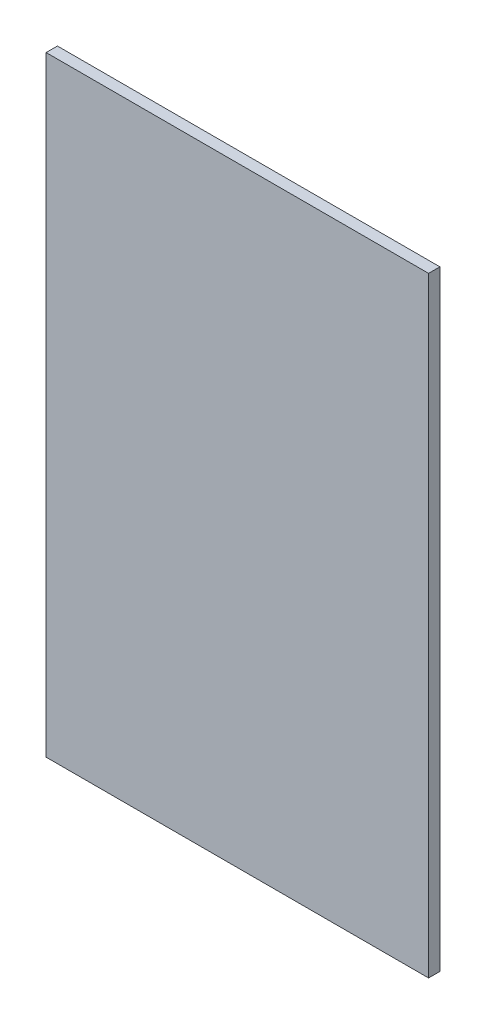
ISO-10303-21;
HEADER;
FILE_DESCRIPTION(('STEP AP214'),'2;1');
FILE_NAME('part.step','',(''),(''),'','','');
FILE_SCHEMA(('AUTOMOTIVE_DESIGN { 1 0 10303 214 1 1 1 1 }'));
ENDSEC;
DATA;
#1=APPLICATION_CONTEXT('core data for automotive mechanical design processes');
#2=APPLICATION_PROTOCOL_DEFINITION('international standard','automotive_design',2000,#1);
#3=PRODUCT_CONTEXT('',#1,'mechanical');
#4=PRODUCT('Part','Part','',(#3));
#5=PRODUCT_RELATED_PRODUCT_CATEGORY('part','',(#4));
#6=PRODUCT_DEFINITION_FORMATION('','',#4);
#7=PRODUCT_DEFINITION_CONTEXT('part definition',#1,'design');
#8=PRODUCT_DEFINITION('design','',#6,#7);
#9=PRODUCT_DEFINITION_SHAPE('','',#8);
#10=(LENGTH_UNIT() NAMED_UNIT(*) SI_UNIT(.MILLI.,.METRE.));
#11=(NAMED_UNIT(*) PLANE_ANGLE_UNIT() SI_UNIT($,.RADIAN.));
#12=(NAMED_UNIT(*) SI_UNIT($,.STERADIAN.) SOLID_ANGLE_UNIT());
#13=UNCERTAINTY_MEASURE_WITH_UNIT(LENGTH_MEASURE(1.E-05),#10,'distance_accuracy_value','');
#14=(GEOMETRIC_REPRESENTATION_CONTEXT(3) GLOBAL_UNCERTAINTY_ASSIGNED_CONTEXT((#13)) GLOBAL_UNIT_ASSIGNED_CONTEXT((#10,
#11,#12)) REPRESENTATION_CONTEXT('',''));
#15=CARTESIAN_POINT('',(0.,0.,0.));
#16=DIRECTION('',(0.,0.,1.));
#17=DIRECTION('',(1.,0.,0.));
#18=AXIS2_PLACEMENT_3D('',#15,#16,#17);
#19=CARTESIAN_POINT('',(1.09802918521339,-88.9383496034944,1.));
#20=DIRECTION('',(0.,1.,0.));
#21=DIRECTION('',(0.,0.,1.));
#22=AXIS2_PLACEMENT_3D('',#19,#20,#21);
#23=PLANE('',#22);
#24=DIRECTION('',(1.,0.,0.));
#25=VECTOR('',#24,1.);
#26=CARTESIAN_POINT('',(1.09802918521339,-88.9383496034944,0.));
#27=LINE('',#26,#25);
#28=CARTESIAN_POINT('',(1.09802918521339,-88.9383496034944,0.));
#29=VERTEX_POINT('',#28);
#30=CARTESIAN_POINT('',(34.8980291852134,-88.9383496034944,0.));
#31=VERTEX_POINT('',#30);
#32=EDGE_CURVE('E96',#29,#31,#27,.T.);
#33=ORIENTED_EDGE('',*,*,#32,.T.);
#34=DIRECTION('',(0.,0.,-1.));
#35=VECTOR('',#34,1.);
#36=CARTESIAN_POINT('',(34.8980291852134,-88.9383496034944,1.));
#37=LINE('',#36,#35);
#38=CARTESIAN_POINT('',(34.8980291852134,-88.9383496034944,1.));
#39=VERTEX_POINT('',#38);
#40=EDGE_CURVE('E11',#39,#31,#37,.T.);
#41=ORIENTED_EDGE('',*,*,#40,.F.);
#42=DIRECTION('',(1.,0.,0.));
#43=VECTOR('',#42,1.);
#44=CARTESIAN_POINT('',(1.09802918521339,-88.9383496034944,1.));
#45=LINE('',#44,#43);
#46=CARTESIAN_POINT('',(1.09802918521339,-88.9383496034944,1.));
#47=VERTEX_POINT('',#46);
#48=EDGE_CURVE('E84',#47,#39,#45,.T.);
#49=ORIENTED_EDGE('',*,*,#48,.F.);
#50=DIRECTION('',(0.,0.,-1.));
#51=VECTOR('',#50,1.);
#52=CARTESIAN_POINT('',(1.09802918521339,-88.9383496034944,1.));
#53=LINE('',#52,#51);
#54=EDGE_CURVE('E92',#47,#29,#53,.T.);
#55=ORIENTED_EDGE('',*,*,#54,.T.);
#56=EDGE_LOOP('',(#33,#41,#49,#55));
#57=FACE_BOUND('',#56,.T.);
#58=ADVANCED_FACE('F33',(#57),#23,.F.);
#59=CARTESIAN_POINT('',(34.8980291852134,-88.9383496034944,1.));
#60=DIRECTION('',(-1.,0.,0.));
#61=DIRECTION('',(0.,0.,1.));
#62=AXIS2_PLACEMENT_3D('',#59,#60,#61);
#63=PLANE('',#62);
#64=DIRECTION('',(0.,1.,0.));
#65=VECTOR('',#64,1.);
#66=CARTESIAN_POINT('',(34.8980291852134,-88.9383496034944,0.));
#67=LINE('',#66,#65);
#68=CARTESIAN_POINT('',(34.8980291852134,-35.0103579299426,0.));
#69=VERTEX_POINT('',#68);
#70=EDGE_CURVE('E88',#31,#69,#67,.T.);
#71=ORIENTED_EDGE('',*,*,#70,.T.);
#72=DIRECTION('',(0.,0.,-1.));
#73=VECTOR('',#72,1.);
#74=CARTESIAN_POINT('',(34.8980291852134,-35.0103579299426,1.));
#75=LINE('',#74,#73);
#76=CARTESIAN_POINT('',(34.8980291852134,-35.0103579299426,1.));
#77=VERTEX_POINT('',#76);
#78=EDGE_CURVE('E41',#77,#69,#75,.T.);
#79=ORIENTED_EDGE('',*,*,#78,.F.);
#80=DIRECTION('',(0.,1.,0.));
#81=VECTOR('',#80,1.);
#82=CARTESIAN_POINT('',(34.8980291852134,-88.9383496034944,1.));
#83=LINE('',#82,#81);
#84=EDGE_CURVE('E79',#39,#77,#83,.T.);
#85=ORIENTED_EDGE('',*,*,#84,.F.);
#86=ORIENTED_EDGE('',*,*,#40,.T.);
#87=EDGE_LOOP('',(#71,#79,#85,#86));
#88=FACE_BOUND('',#87,.T.);
#89=ADVANCED_FACE('F87',(#88),#63,.F.);
#90=CARTESIAN_POINT('',(34.8980291852134,-35.0103579299426,1.));
#91=DIRECTION('',(0.,-1.,0.));
#92=DIRECTION('',(1.,0.,0.));
#93=AXIS2_PLACEMENT_3D('',#90,#91,#92);
#94=PLANE('',#93);
#95=DIRECTION('',(-1.,0.,0.));
#96=VECTOR('',#95,1.);
#97=CARTESIAN_POINT('',(34.8980291852134,-35.0103579299426,0.));
#98=LINE('',#97,#96);
#99=CARTESIAN_POINT('',(1.09802918521339,-35.0103579299426,0.));
#100=VERTEX_POINT('',#99);
#101=EDGE_CURVE('E66',#69,#100,#98,.T.);
#102=ORIENTED_EDGE('',*,*,#101,.T.);
#103=DIRECTION('',(0.,0.,-1.));
#104=VECTOR('',#103,1.);
#105=CARTESIAN_POINT('',(1.09802918521339,-35.0103579299426,1.));
#106=LINE('',#105,#104);
#107=CARTESIAN_POINT('',(1.09802918521339,-35.0103579299426,1.));
#108=VERTEX_POINT('',#107);
#109=EDGE_CURVE('E89',#108,#100,#106,.T.);
#110=ORIENTED_EDGE('',*,*,#109,.F.);
#111=DIRECTION('',(-1.,0.,0.));
#112=VECTOR('',#111,1.);
#113=CARTESIAN_POINT('',(34.8980291852134,-35.0103579299426,1.));
#114=LINE('',#113,#112);
#115=EDGE_CURVE('E82',#77,#108,#114,.T.);
#116=ORIENTED_EDGE('',*,*,#115,.F.);
#117=ORIENTED_EDGE('',*,*,#78,.T.);
#118=EDGE_LOOP('',(#102,#110,#116,#117));
#119=FACE_BOUND('',#118,.T.);
#120=ADVANCED_FACE('F90',(#119),#94,.F.);
#121=CARTESIAN_POINT('',(1.09802918521339,-35.0103579299426,1.));
#122=DIRECTION('',(1.,0.,0.));
#123=DIRECTION('',(0.,1.,0.));
#124=AXIS2_PLACEMENT_3D('',#121,#122,#123);
#125=PLANE('',#124);
#126=DIRECTION('',(0.,-1.,0.));
#127=VECTOR('',#126,1.);
#128=CARTESIAN_POINT('',(1.09802918521339,-35.0103579299426,0.));
#129=LINE('',#128,#127);
#130=EDGE_CURVE('E72',#100,#29,#129,.T.);
#131=ORIENTED_EDGE('',*,*,#130,.T.);
#132=ORIENTED_EDGE('',*,*,#54,.F.);
#133=DIRECTION('',(0.,-1.,0.));
#134=VECTOR('',#133,1.);
#135=CARTESIAN_POINT('',(1.09802918521339,-35.0103579299426,1.));
#136=LINE('',#135,#134);
#137=EDGE_CURVE('E49',#108,#47,#136,.T.);
#138=ORIENTED_EDGE('',*,*,#137,.F.);
#139=ORIENTED_EDGE('',*,*,#109,.T.);
#140=EDGE_LOOP('',(#131,#132,#138,#139));
#141=FACE_BOUND('',#140,.T.);
#142=ADVANCED_FACE('F103',(#141),#125,.F.);
#143=CARTESIAN_POINT('',(0.,0.,1.));
#144=DIRECTION('',(0.,0.,1.));
#145=DIRECTION('',(1.,0.,0.));
#146=AXIS2_PLACEMENT_3D('',#143,#144,#145);
#147=PLANE('',#146);
#148=ORIENTED_EDGE('',*,*,#48,.T.);
#149=ORIENTED_EDGE('',*,*,#84,.T.);
#150=ORIENTED_EDGE('',*,*,#115,.T.);
#151=ORIENTED_EDGE('',*,*,#137,.T.);
#152=EDGE_LOOP('',(#148,#149,#150,#151));
#153=FACE_BOUND('',#152,.T.);
#154=ADVANCED_FACE('F80',(#153),#147,.T.);
#155=CARTESIAN_POINT('',(0.,0.,0.));
#156=DIRECTION('',(0.,0.,1.));
#157=DIRECTION('',(1.,0.,0.));
#158=AXIS2_PLACEMENT_3D('',#155,#156,#157);
#159=PLANE('',#158);
#160=ORIENTED_EDGE('',*,*,#32,.F.);
#161=ORIENTED_EDGE('',*,*,#130,.F.);
#162=ORIENTED_EDGE('',*,*,#101,.F.);
#163=ORIENTED_EDGE('',*,*,#70,.F.);
#164=EDGE_LOOP('',(#160,#161,#162,#163));
#165=FACE_BOUND('',#164,.T.);
#166=ADVANCED_FACE('F106',(#165),#159,.F.);
#167=CLOSED_SHELL('',(#58,#89,#120,#142,#154,#166));
#168=MANIFOLD_SOLID_BREP('B2',#167);
#169=ADVANCED_BREP_SHAPE_REPRESENTATION('',(#18,#168),#14);
#170=SHAPE_DEFINITION_REPRESENTATION(#9,#169);
ENDSEC;
END-ISO-10303-21;
